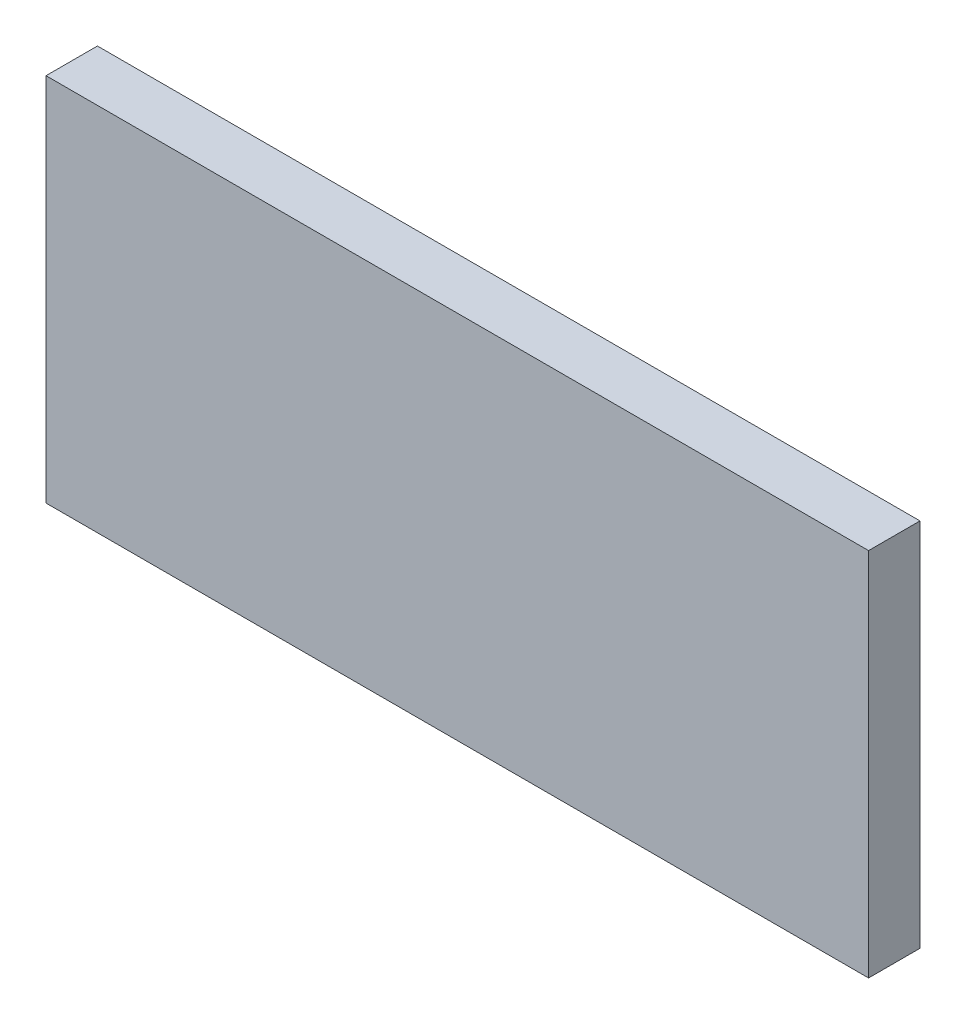
ISO-10303-21;
HEADER;
FILE_DESCRIPTION(('STEP AP214'),'2;1');
FILE_NAME('part.step','',(''),(''),'','','');
FILE_SCHEMA(('AUTOMOTIVE_DESIGN { 1 0 10303 214 1 1 1 1 }'));
ENDSEC;
DATA;
#1=APPLICATION_CONTEXT('core data for automotive mechanical design processes');
#2=APPLICATION_PROTOCOL_DEFINITION('international standard','automotive_design',2000,#1);
#3=PRODUCT_CONTEXT('',#1,'mechanical');
#4=PRODUCT('Part','Part','',(#3));
#5=PRODUCT_RELATED_PRODUCT_CATEGORY('part','',(#4));
#6=PRODUCT_DEFINITION_FORMATION('','',#4);
#7=PRODUCT_DEFINITION_CONTEXT('part definition',#1,'design');
#8=PRODUCT_DEFINITION('design','',#6,#7);
#9=PRODUCT_DEFINITION_SHAPE('','',#8);
#10=(LENGTH_UNIT() NAMED_UNIT(*) SI_UNIT(.MILLI.,.METRE.));
#11=(NAMED_UNIT(*) PLANE_ANGLE_UNIT() SI_UNIT($,.RADIAN.));
#12=(NAMED_UNIT(*) SI_UNIT($,.STERADIAN.) SOLID_ANGLE_UNIT());
#13=UNCERTAINTY_MEASURE_WITH_UNIT(LENGTH_MEASURE(1.E-05),#10,'distance_accuracy_value','');
#14=(GEOMETRIC_REPRESENTATION_CONTEXT(3) GLOBAL_UNCERTAINTY_ASSIGNED_CONTEXT((#13)) GLOBAL_UNIT_ASSIGNED_CONTEXT((#10,
#11,#12)) REPRESENTATION_CONTEXT('',''));
#15=CARTESIAN_POINT('',(0.,0.,0.));
#16=DIRECTION('',(0.,0.,1.));
#17=DIRECTION('',(1.,0.,0.));
#18=AXIS2_PLACEMENT_3D('',#15,#16,#17);
#19=CARTESIAN_POINT('',(0.,0.,0.));
#20=DIRECTION('',(0.,0.,-1.));
#21=DIRECTION('',(-1.,0.,0.));
#22=AXIS2_PLACEMENT_3D('',#19,#20,#21);
#23=PLANE('',#22);
#24=DIRECTION('',(1.,0.,0.));
#25=VECTOR('',#24,1.);
#26=CARTESIAN_POINT('',(39.9301584610165,25.1698415389835,0.));
#27=LINE('',#26,#25);
#28=CARTESIAN_POINT('',(-40.0698415389835,25.1698415389835,0.));
#29=VERTEX_POINT('',#28);
#30=CARTESIAN_POINT('',(39.9301584610165,25.1698415389835,0.));
#31=VERTEX_POINT('',#30);
#32=EDGE_CURVE('E132',#29,#31,#27,.T.);
#33=ORIENTED_EDGE('',*,*,#32,.F.);
#34=DIRECTION('',(0.,-1.,0.));
#35=VECTOR('',#34,1.);
#36=CARTESIAN_POINT('',(-40.0698415389835,25.1698415389835,0.));
#37=LINE('',#36,#35);
#38=CARTESIAN_POINT('',(-40.0698415389835,61.1698415389835,0.));
#39=VERTEX_POINT('',#38);
#40=EDGE_CURVE('E78',#39,#29,#37,.T.);
#41=ORIENTED_EDGE('',*,*,#40,.F.);
#42=DIRECTION('',(-1.,0.,0.));
#43=VECTOR('',#42,1.);
#44=CARTESIAN_POINT('',(39.9301584610165,61.1698415389835,0.));
#45=LINE('',#44,#43);
#46=CARTESIAN_POINT('',(39.9301584610165,61.1698415389835,0.));
#47=VERTEX_POINT('',#46);
#48=EDGE_CURVE('E148',#47,#39,#45,.T.);
#49=ORIENTED_EDGE('',*,*,#48,.F.);
#50=DIRECTION('',(0.,1.,0.));
#51=VECTOR('',#50,1.);
#52=CARTESIAN_POINT('',(39.9301584610165,25.1698415389835,0.));
#53=LINE('',#52,#51);
#54=EDGE_CURVE('E135',#31,#47,#53,.T.);
#55=ORIENTED_EDGE('',*,*,#54,.F.);
#56=EDGE_LOOP('',(#33,#41,#49,#55));
#57=FACE_BOUND('',#56,.T.);
#58=DIRECTION('',(1.,0.,0.));
#59=VECTOR('',#58,1.);
#60=CARTESIAN_POINT('',(-35.5,55.,0.));
#61=LINE('',#60,#59);
#62=CARTESIAN_POINT('',(-35.5,55.,0.));
#63=VERTEX_POINT('',#62);
#64=CARTESIAN_POINT('',(35.5,55.,0.));
#65=VERTEX_POINT('',#64);
#66=EDGE_CURVE('E263',#63,#65,#61,.T.);
#67=ORIENTED_EDGE('',*,*,#66,.F.);
#68=DIRECTION('',(0.,1.,0.));
#69=VECTOR('',#68,1.);
#70=CARTESIAN_POINT('',(-35.5,31.2,0.));
#71=LINE('',#70,#69);
#72=CARTESIAN_POINT('',(-35.5,31.2,0.));
#73=VERTEX_POINT('',#72);
#74=EDGE_CURVE('E130',#73,#63,#71,.T.);
#75=ORIENTED_EDGE('',*,*,#74,.F.);
#76=DIRECTION('',(-1.,0.,0.));
#77=VECTOR('',#76,1.);
#78=CARTESIAN_POINT('',(35.5,31.2,0.));
#79=LINE('',#78,#77);
#80=CARTESIAN_POINT('',(35.5,31.2,0.));
#81=VERTEX_POINT('',#80);
#82=EDGE_CURVE('E126',#81,#73,#79,.T.);
#83=ORIENTED_EDGE('',*,*,#82,.F.);
#84=DIRECTION('',(0.,-1.,0.));
#85=VECTOR('',#84,1.);
#86=CARTESIAN_POINT('',(35.5,55.,0.));
#87=LINE('',#86,#85);
#88=EDGE_CURVE('E260',#65,#81,#87,.T.);
#89=ORIENTED_EDGE('',*,*,#88,.F.);
#90=EDGE_LOOP('',(#67,#75,#83,#89));
#91=FACE_BOUND('',#90,.T.);
#92=ADVANCED_FACE('F33',(#57,#91),#23,.T.);
#93=CARTESIAN_POINT('',(39.9301584610165,25.1698415389835,5.));
#94=DIRECTION('',(0.,1.,0.));
#95=DIRECTION('',(-1.,0.,0.));
#96=AXIS2_PLACEMENT_3D('',#93,#94,#95);
#97=PLANE('',#96);
#98=ORIENTED_EDGE('',*,*,#32,.T.);
#99=DIRECTION('',(0.,0.,-1.));
#100=VECTOR('',#99,1.);
#101=CARTESIAN_POINT('',(39.9301584610165,25.1698415389835,5.));
#102=LINE('',#101,#100);
#103=CARTESIAN_POINT('',(39.9301584610165,25.1698415389835,5.));
#104=VERTEX_POINT('',#103);
#105=EDGE_CURVE('E11',#104,#31,#102,.T.);
#106=ORIENTED_EDGE('',*,*,#105,.F.);
#107=DIRECTION('',(1.,0.,0.));
#108=VECTOR('',#107,1.);
#109=CARTESIAN_POINT('',(39.9301584610165,25.1698415389835,5.));
#110=LINE('',#109,#108);
#111=CARTESIAN_POINT('',(-40.0698415389835,25.1698415389835,5.));
#112=VERTEX_POINT('',#111);
#113=EDGE_CURVE('E140',#112,#104,#110,.T.);
#114=ORIENTED_EDGE('',*,*,#113,.F.);
#115=DIRECTION('',(0.,0.,-1.));
#116=VECTOR('',#115,1.);
#117=CARTESIAN_POINT('',(-40.0698415389835,25.1698415389835,5.));
#118=LINE('',#117,#116);
#119=EDGE_CURVE('E145',#112,#29,#118,.T.);
#120=ORIENTED_EDGE('',*,*,#119,.T.);
#121=EDGE_LOOP('',(#98,#106,#114,#120));
#122=FACE_BOUND('',#121,.T.);
#123=ADVANCED_FACE('F35',(#122),#97,.F.);
#124=CARTESIAN_POINT('',(39.9301584610165,25.1698415389835,5.));
#125=DIRECTION('',(-1.,0.,0.));
#126=DIRECTION('',(0.,0.,1.));
#127=AXIS2_PLACEMENT_3D('',#124,#125,#126);
#128=PLANE('',#127);
#129=ORIENTED_EDGE('',*,*,#54,.T.);
#130=DIRECTION('',(0.,0.,-1.));
#131=VECTOR('',#130,1.);
#132=CARTESIAN_POINT('',(39.9301584610165,61.1698415389835,5.));
#133=LINE('',#132,#131);
#134=CARTESIAN_POINT('',(39.9301584610165,61.1698415389835,5.));
#135=VERTEX_POINT('',#134);
#136=EDGE_CURVE('E41',#135,#47,#133,.T.);
#137=ORIENTED_EDGE('',*,*,#136,.F.);
#138=DIRECTION('',(0.,1.,0.));
#139=VECTOR('',#138,1.);
#140=CARTESIAN_POINT('',(39.9301584610165,25.1698415389835,5.));
#141=LINE('',#140,#139);
#142=EDGE_CURVE('E85',#104,#135,#141,.T.);
#143=ORIENTED_EDGE('',*,*,#142,.F.);
#144=ORIENTED_EDGE('',*,*,#105,.T.);
#145=EDGE_LOOP('',(#129,#137,#143,#144));
#146=FACE_BOUND('',#145,.T.);
#147=ADVANCED_FACE('F174',(#146),#128,.F.);
#148=CARTESIAN_POINT('',(39.9301584610165,61.1698415389835,5.));
#149=DIRECTION('',(0.,-1.,0.));
#150=DIRECTION('',(0.,0.,-1.));
#151=AXIS2_PLACEMENT_3D('',#148,#149,#150);
#152=PLANE('',#151);
#153=ORIENTED_EDGE('',*,*,#48,.T.);
#154=DIRECTION('',(0.,0.,-1.));
#155=VECTOR('',#154,1.);
#156=CARTESIAN_POINT('',(-40.0698415389835,61.1698415389835,5.));
#157=LINE('',#156,#155);
#158=CARTESIAN_POINT('',(-40.0698415389835,61.1698415389835,5.));
#159=VERTEX_POINT('',#158);
#160=EDGE_CURVE('E152',#159,#39,#157,.T.);
#161=ORIENTED_EDGE('',*,*,#160,.F.);
#162=DIRECTION('',(-1.,0.,0.));
#163=VECTOR('',#162,1.);
#164=CARTESIAN_POINT('',(39.9301584610165,61.1698415389835,5.));
#165=LINE('',#164,#163);
#166=EDGE_CURVE('E143',#135,#159,#165,.T.);
#167=ORIENTED_EDGE('',*,*,#166,.F.);
#168=ORIENTED_EDGE('',*,*,#136,.T.);
#169=EDGE_LOOP('',(#153,#161,#167,#168));
#170=FACE_BOUND('',#169,.T.);
#171=ADVANCED_FACE('F157',(#170),#152,.F.);
#172=CARTESIAN_POINT('',(-40.0698415389835,25.1698415389835,5.));
#173=DIRECTION('',(1.,0.,0.));
#174=DIRECTION('',(0.,0.,-1.));
#175=AXIS2_PLACEMENT_3D('',#172,#173,#174);
#176=PLANE('',#175);
#177=ORIENTED_EDGE('',*,*,#40,.T.);
#178=ORIENTED_EDGE('',*,*,#119,.F.);
#179=DIRECTION('',(0.,-1.,0.));
#180=VECTOR('',#179,1.);
#181=CARTESIAN_POINT('',(-40.0698415389835,25.1698415389835,5.));
#182=LINE('',#181,#180);
#183=EDGE_CURVE('E57',#159,#112,#182,.T.);
#184=ORIENTED_EDGE('',*,*,#183,.F.);
#185=ORIENTED_EDGE('',*,*,#160,.T.);
#186=EDGE_LOOP('',(#177,#178,#184,#185));
#187=FACE_BOUND('',#186,.T.);
#188=ADVANCED_FACE('F165',(#187),#176,.F.);
#189=CARTESIAN_POINT('',(0.,0.,5.));
#190=DIRECTION('',(0.,0.,-1.));
#191=DIRECTION('',(-1.,0.,0.));
#192=AXIS2_PLACEMENT_3D('',#189,#190,#191);
#193=PLANE('',#192);
#194=ORIENTED_EDGE('',*,*,#113,.T.);
#195=ORIENTED_EDGE('',*,*,#142,.T.);
#196=ORIENTED_EDGE('',*,*,#166,.T.);
#197=ORIENTED_EDGE('',*,*,#183,.T.);
#198=EDGE_LOOP('',(#194,#195,#196,#197));
#199=FACE_BOUND('',#198,.T.);
#200=ADVANCED_FACE('F167',(#199),#193,.F.);
#201=CARTESIAN_POINT('',(-35.5,31.2,-2.));
#202=DIRECTION('',(1.,0.,0.));
#203=DIRECTION('',(0.,0.,-1.));
#204=AXIS2_PLACEMENT_3D('',#201,#202,#203);
#205=PLANE('',#204);
#206=ORIENTED_EDGE('',*,*,#74,.T.);
#207=DIRECTION('',(0.,0.,1.));
#208=VECTOR('',#207,1.);
#209=CARTESIAN_POINT('',(-35.5,55.,-2.));
#210=LINE('',#209,#208);
#211=CARTESIAN_POINT('',(-35.5,55.,-2.));
#212=VERTEX_POINT('',#211);
#213=EDGE_CURVE('E111',#212,#63,#210,.T.);
#214=ORIENTED_EDGE('',*,*,#213,.F.);
#215=DIRECTION('',(0.,1.,0.));
#216=VECTOR('',#215,1.);
#217=CARTESIAN_POINT('',(-35.5,31.2,-2.));
#218=LINE('',#217,#216);
#219=CARTESIAN_POINT('',(-35.5,31.2,-2.));
#220=VERTEX_POINT('',#219);
#221=EDGE_CURVE('E118',#220,#212,#218,.T.);
#222=ORIENTED_EDGE('',*,*,#221,.F.);
#223=DIRECTION('',(0.,0.,1.));
#224=VECTOR('',#223,1.);
#225=CARTESIAN_POINT('',(-35.5,31.2,-2.));
#226=LINE('',#225,#224);
#227=EDGE_CURVE('E258',#220,#73,#226,.T.);
#228=ORIENTED_EDGE('',*,*,#227,.T.);
#229=EDGE_LOOP('',(#206,#214,#222,#228));
#230=FACE_BOUND('',#229,.T.);
#231=ADVANCED_FACE('F128',(#230),#205,.F.);
#232=CARTESIAN_POINT('',(-35.5,55.,-2.));
#233=DIRECTION('',(0.,-1.,0.));
#234=DIRECTION('',(1.,0.,0.));
#235=AXIS2_PLACEMENT_3D('',#232,#233,#234);
#236=PLANE('',#235);
#237=ORIENTED_EDGE('',*,*,#66,.T.);
#238=DIRECTION('',(0.,0.,1.));
#239=VECTOR('',#238,1.);
#240=CARTESIAN_POINT('',(35.5,55.,-2.));
#241=LINE('',#240,#239);
#242=CARTESIAN_POINT('',(35.5,55.,-2.));
#243=VERTEX_POINT('',#242);
#244=EDGE_CURVE('E114',#243,#65,#241,.T.);
#245=ORIENTED_EDGE('',*,*,#244,.F.);
#246=DIRECTION('',(1.,0.,0.));
#247=VECTOR('',#246,1.);
#248=CARTESIAN_POINT('',(-35.5,55.,-2.));
#249=LINE('',#248,#247);
#250=EDGE_CURVE('E107',#212,#243,#249,.T.);
#251=ORIENTED_EDGE('',*,*,#250,.F.);
#252=ORIENTED_EDGE('',*,*,#213,.T.);
#253=EDGE_LOOP('',(#237,#245,#251,#252));
#254=FACE_BOUND('',#253,.T.);
#255=ADVANCED_FACE('F109',(#254),#236,.F.);
#256=CARTESIAN_POINT('',(35.5,55.,-2.));
#257=DIRECTION('',(-1.,0.,0.));
#258=DIRECTION('',(0.,-1.,0.));
#259=AXIS2_PLACEMENT_3D('',#256,#257,#258);
#260=PLANE('',#259);
#261=ORIENTED_EDGE('',*,*,#88,.T.);
#262=DIRECTION('',(0.,0.,1.));
#263=VECTOR('',#262,1.);
#264=CARTESIAN_POINT('',(35.5,31.2,-2.));
#265=LINE('',#264,#263);
#266=CARTESIAN_POINT('',(35.5,31.2,-2.));
#267=VERTEX_POINT('',#266);
#268=EDGE_CURVE('E48',#267,#81,#265,.T.);
#269=ORIENTED_EDGE('',*,*,#268,.F.);
#270=DIRECTION('',(0.,-1.,0.));
#271=VECTOR('',#270,1.);
#272=CARTESIAN_POINT('',(35.5,55.,-2.));
#273=LINE('',#272,#271);
#274=EDGE_CURVE('E117',#243,#267,#273,.T.);
#275=ORIENTED_EDGE('',*,*,#274,.F.);
#276=ORIENTED_EDGE('',*,*,#244,.T.);
#277=EDGE_LOOP('',(#261,#269,#275,#276));
#278=FACE_BOUND('',#277,.T.);
#279=ADVANCED_FACE('F186',(#278),#260,.F.);
#280=CARTESIAN_POINT('',(35.5,31.2,-2.));
#281=DIRECTION('',(0.,1.,0.));
#282=DIRECTION('',(-1.,0.,0.));
#283=AXIS2_PLACEMENT_3D('',#280,#281,#282);
#284=PLANE('',#283);
#285=ORIENTED_EDGE('',*,*,#82,.T.);
#286=ORIENTED_EDGE('',*,*,#227,.F.);
#287=DIRECTION('',(-1.,0.,0.));
#288=VECTOR('',#287,1.);
#289=CARTESIAN_POINT('',(35.5,31.2,-2.));
#290=LINE('',#289,#288);
#291=EDGE_CURVE('E122',#267,#220,#290,.T.);
#292=ORIENTED_EDGE('',*,*,#291,.F.);
#293=ORIENTED_EDGE('',*,*,#268,.T.);
#294=EDGE_LOOP('',(#285,#286,#292,#293));
#295=FACE_BOUND('',#294,.T.);
#296=ADVANCED_FACE('F189',(#295),#284,.F.);
#297=CARTESIAN_POINT('',(0.,0.,-2.));
#298=DIRECTION('',(0.,0.,-1.));
#299=DIRECTION('',(-1.,0.,0.));
#300=AXIS2_PLACEMENT_3D('',#297,#298,#299);
#301=PLANE('',#300);
#302=ORIENTED_EDGE('',*,*,#221,.T.);
#303=ORIENTED_EDGE('',*,*,#250,.T.);
#304=ORIENTED_EDGE('',*,*,#274,.T.);
#305=ORIENTED_EDGE('',*,*,#291,.T.);
#306=EDGE_LOOP('',(#302,#303,#304,#305));
#307=FACE_BOUND('',#306,.T.);
#308=ADVANCED_FACE('F121',(#307),#301,.T.);
#309=CLOSED_SHELL('',(#92,#123,#147,#171,#188,#200,#231,#255,#279,#296,#308));
#310=MANIFOLD_SOLID_BREP('B2',#309);
#311=ADVANCED_BREP_SHAPE_REPRESENTATION('',(#18,#310),#14);
#312=SHAPE_DEFINITION_REPRESENTATION(#9,#311);
ENDSEC;
END-ISO-10303-21;
